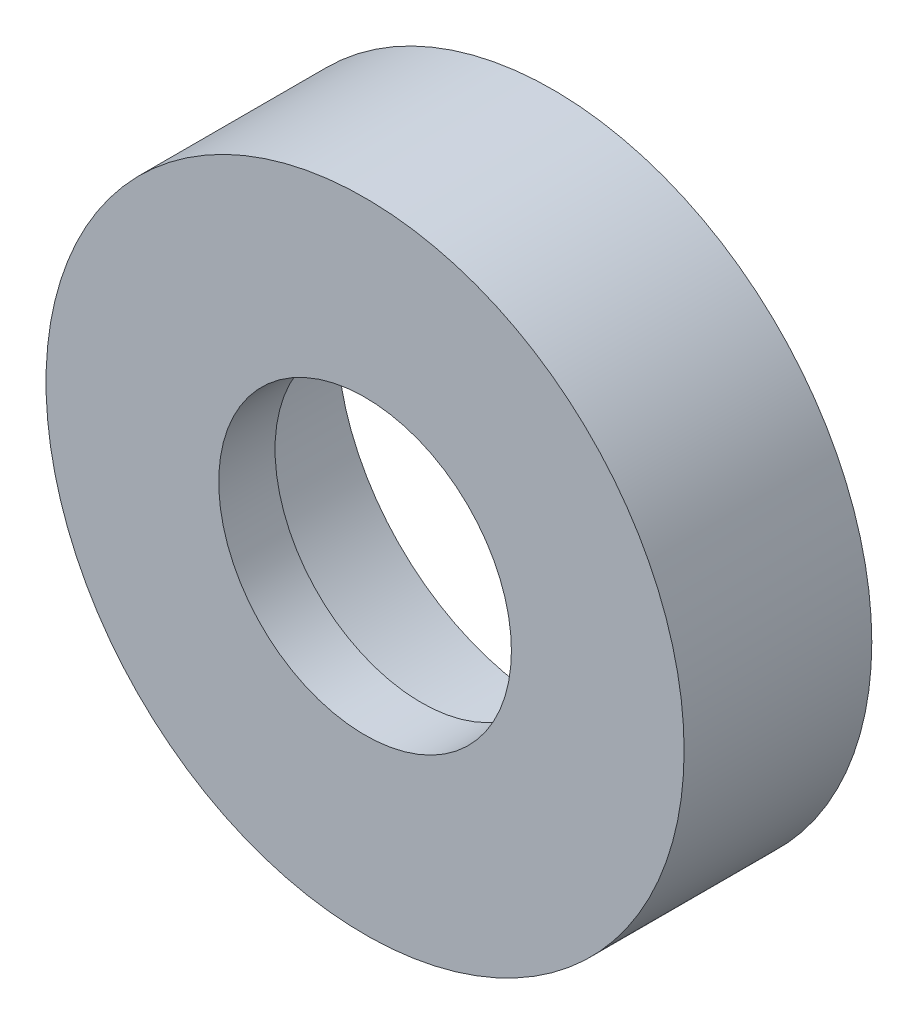
ISO-10303-21;
HEADER;
FILE_DESCRIPTION(('STEP AP214'),'2;1');
FILE_NAME('part.step','',(''),(''),'','','');
FILE_SCHEMA(('AUTOMOTIVE_DESIGN { 1 0 10303 214 1 1 1 1 }'));
ENDSEC;
DATA;
#1=APPLICATION_CONTEXT('core data for automotive mechanical design processes');
#2=APPLICATION_PROTOCOL_DEFINITION('international standard','automotive_design',2000,#1);
#3=PRODUCT_CONTEXT('',#1,'mechanical');
#4=PRODUCT('Part','Part','',(#3));
#5=PRODUCT_RELATED_PRODUCT_CATEGORY('part','',(#4));
#6=PRODUCT_DEFINITION_FORMATION('','',#4);
#7=PRODUCT_DEFINITION_CONTEXT('part definition',#1,'design');
#8=PRODUCT_DEFINITION('design','',#6,#7);
#9=PRODUCT_DEFINITION_SHAPE('','',#8);
#10=(LENGTH_UNIT() NAMED_UNIT(*) SI_UNIT(.MILLI.,.METRE.));
#11=(NAMED_UNIT(*) PLANE_ANGLE_UNIT() SI_UNIT($,.RADIAN.));
#12=(NAMED_UNIT(*) SI_UNIT($,.STERADIAN.) SOLID_ANGLE_UNIT());
#13=UNCERTAINTY_MEASURE_WITH_UNIT(LENGTH_MEASURE(1.E-05),#10,'distance_accuracy_value','');
#14=(GEOMETRIC_REPRESENTATION_CONTEXT(3) GLOBAL_UNCERTAINTY_ASSIGNED_CONTEXT((#13)) GLOBAL_UNIT_ASSIGNED_CONTEXT((#10,
#11,#12)) REPRESENTATION_CONTEXT('',''));
#15=CARTESIAN_POINT('',(0.,0.,0.));
#16=DIRECTION('',(0.,0.,1.));
#17=DIRECTION('',(1.,0.,0.));
#18=AXIS2_PLACEMENT_3D('',#15,#16,#17);
#19=CARTESIAN_POINT('',(0.,0.,10.));
#20=DIRECTION('',(0.,0.,-1.));
#21=DIRECTION('',(-1.,0.,0.));
#22=AXIS2_PLACEMENT_3D('',#19,#20,#21);
#23=CYLINDRICAL_SURFACE('',#22,11.5);
#24=CARTESIAN_POINT('',(0.,0.,0.));
#25=DIRECTION('',(0.,0.,1.));
#26=DIRECTION('',(1.,0.,0.));
#27=AXIS2_PLACEMENT_3D('',#24,#25,#26);
#28=CIRCLE('',#27,11.5);
#29=CARTESIAN_POINT('',(11.5,0.,0.));
#30=VERTEX_POINT('',#29);
#31=EDGE_CURVE('E42',#30,#30,#28,.T.);
#32=ORIENTED_EDGE('',*,*,#31,.F.);
#33=EDGE_LOOP('',(#32));
#34=FACE_BOUND('',#33,.T.);
#35=CARTESIAN_POINT('',(0.,0.,7.));
#36=DIRECTION('',(0.,0.,1.));
#37=DIRECTION('',(1.,0.,0.));
#38=AXIS2_PLACEMENT_3D('',#35,#36,#37);
#39=CIRCLE('',#38,11.5);
#40=CARTESIAN_POINT('',(11.5,0.,7.));
#41=VERTEX_POINT('',#40);
#42=EDGE_CURVE('E46',#41,#41,#39,.T.);
#43=ORIENTED_EDGE('',*,*,#42,.T.);
#44=EDGE_LOOP('',(#43));
#45=FACE_BOUND('',#44,.T.);
#46=ADVANCED_FACE('F31',(#34,#45),#23,.F.);
#47=CARTESIAN_POINT('',(0.,0.,10.));
#48=DIRECTION('',(0.,0.,1.));
#49=DIRECTION('',(1.,0.,0.));
#50=AXIS2_PLACEMENT_3D('',#47,#48,#49);
#51=PLANE('',#50);
#52=CARTESIAN_POINT('',(0.,0.,10.));
#53=DIRECTION('',(0.,0.,1.));
#54=DIRECTION('',(1.,0.,0.));
#55=AXIS2_PLACEMENT_3D('',#52,#53,#54);
#56=CIRCLE('',#55,17.);
#57=CARTESIAN_POINT('',(17.,0.,10.));
#58=VERTEX_POINT('',#57);
#59=EDGE_CURVE('E10',#58,#58,#56,.T.);
#60=ORIENTED_EDGE('',*,*,#59,.T.);
#61=EDGE_LOOP('',(#60));
#62=FACE_BOUND('',#61,.T.);
#63=CARTESIAN_POINT('',(0.,0.,10.));
#64=DIRECTION('',(0.,0.,1.));
#65=DIRECTION('',(1.,0.,0.));
#66=AXIS2_PLACEMENT_3D('',#63,#64,#65);
#67=CIRCLE('',#66,7.79722886611658);
#68=CARTESIAN_POINT('',(7.79722886611658,0.,10.));
#69=VERTEX_POINT('',#68);
#70=EDGE_CURVE('E50',#69,#69,#67,.T.);
#71=ORIENTED_EDGE('',*,*,#70,.F.);
#72=EDGE_LOOP('',(#71));
#73=FACE_BOUND('',#72,.T.);
#74=ADVANCED_FACE('F65',(#62,#73),#51,.T.);
#75=CARTESIAN_POINT('',(0.,0.,0.));
#76=DIRECTION('',(0.,0.,1.));
#77=DIRECTION('',(1.,0.,0.));
#78=AXIS2_PLACEMENT_3D('',#75,#76,#77);
#79=PLANE('',#78);
#80=CARTESIAN_POINT('',(0.,0.,0.));
#81=DIRECTION('',(0.,0.,1.));
#82=DIRECTION('',(1.,0.,0.));
#83=AXIS2_PLACEMENT_3D('',#80,#81,#82);
#84=CIRCLE('',#83,17.);
#85=CARTESIAN_POINT('',(17.,0.,0.));
#86=VERTEX_POINT('',#85);
#87=EDGE_CURVE('E35',#86,#86,#84,.T.);
#88=ORIENTED_EDGE('',*,*,#87,.F.);
#89=EDGE_LOOP('',(#88));
#90=FACE_BOUND('',#89,.T.);
#91=ORIENTED_EDGE('',*,*,#31,.T.);
#92=EDGE_LOOP('',(#91));
#93=FACE_BOUND('',#92,.T.);
#94=ADVANCED_FACE('F67',(#90,#93),#79,.F.);
#95=CARTESIAN_POINT('',(0.,0.,10.));
#96=DIRECTION('',(0.,0.,-1.));
#97=DIRECTION('',(-1.,0.,0.));
#98=AXIS2_PLACEMENT_3D('',#95,#96,#97);
#99=CYLINDRICAL_SURFACE('',#98,17.);
#100=ORIENTED_EDGE('',*,*,#59,.F.);
#101=EDGE_LOOP('',(#100));
#102=FACE_BOUND('',#101,.T.);
#103=ORIENTED_EDGE('',*,*,#87,.T.);
#104=EDGE_LOOP('',(#103));
#105=FACE_BOUND('',#104,.T.);
#106=ADVANCED_FACE('F33',(#102,#105),#99,.T.);
#107=CARTESIAN_POINT('',(0.,0.,7.));
#108=DIRECTION('',(0.,0.,1.));
#109=DIRECTION('',(1.,0.,0.));
#110=AXIS2_PLACEMENT_3D('',#107,#108,#109);
#111=PLANE('',#110);
#112=CARTESIAN_POINT('',(0.,0.,7.));
#113=DIRECTION('',(0.,0.,1.));
#114=DIRECTION('',(1.,0.,0.));
#115=AXIS2_PLACEMENT_3D('',#112,#113,#114);
#116=CIRCLE('',#115,7.79722886611658);
#117=CARTESIAN_POINT('',(7.79722886611658,0.,7.));
#118=VERTEX_POINT('',#117);
#119=EDGE_CURVE('E49',#118,#118,#116,.T.);
#120=ORIENTED_EDGE('',*,*,#119,.T.);
#121=EDGE_LOOP('',(#120));
#122=FACE_BOUND('',#121,.T.);
#123=ORIENTED_EDGE('',*,*,#42,.F.);
#124=EDGE_LOOP('',(#123));
#125=FACE_BOUND('',#124,.T.);
#126=ADVANCED_FACE('F56',(#122,#125),#111,.F.);
#127=CARTESIAN_POINT('',(0.,0.,7.));
#128=DIRECTION('',(0.,0.,1.));
#129=DIRECTION('',(1.,0.,0.));
#130=AXIS2_PLACEMENT_3D('',#127,#128,#129);
#131=CYLINDRICAL_SURFACE('',#130,7.79722886611658);
#132=ORIENTED_EDGE('',*,*,#119,.F.);
#133=EDGE_LOOP('',(#132));
#134=FACE_BOUND('',#133,.T.);
#135=ORIENTED_EDGE('',*,*,#70,.T.);
#136=EDGE_LOOP('',(#135));
#137=FACE_BOUND('',#136,.T.);
#138=ADVANCED_FACE('F59',(#134,#137),#131,.F.);
#139=CLOSED_SHELL('',(#46,#74,#94,#106,#126,#138));
#140=MANIFOLD_SOLID_BREP('B2',#139);
#141=ADVANCED_BREP_SHAPE_REPRESENTATION('',(#18,#140),#14);
#142=SHAPE_DEFINITION_REPRESENTATION(#9,#141);
ENDSEC;
END-ISO-10303-21;
